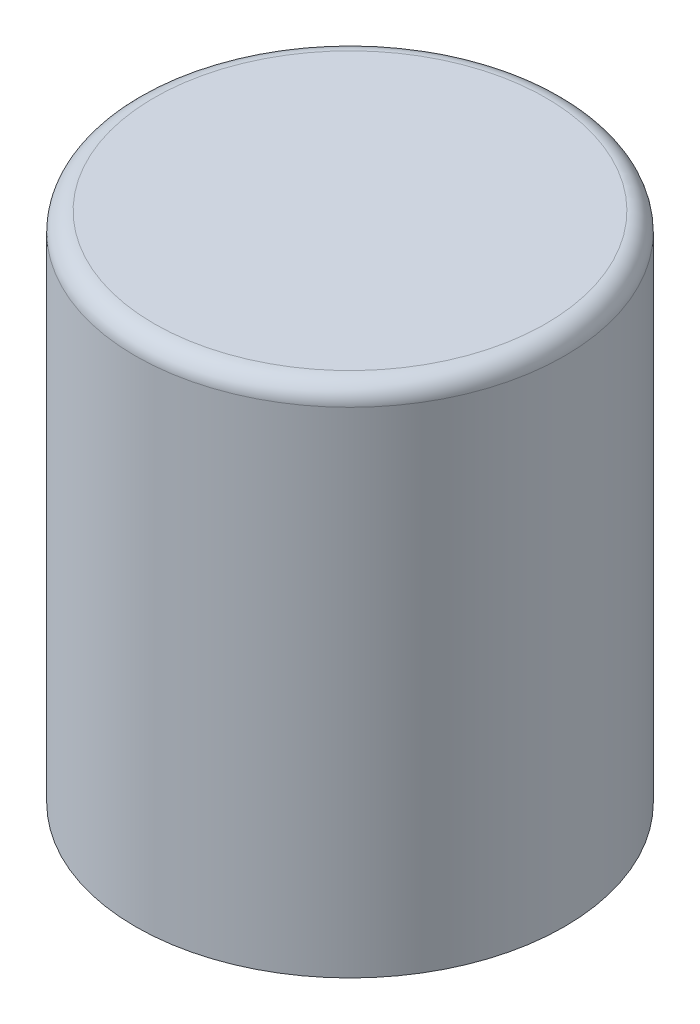
ISO-10303-21;
HEADER;
FILE_DESCRIPTION(('STEP AP214'),'2;1');
FILE_NAME('part.step','',(''),(''),'','','');
FILE_SCHEMA(('AUTOMOTIVE_DESIGN { 1 0 10303 214 1 1 1 1 }'));
ENDSEC;
DATA;
#1=APPLICATION_CONTEXT('core data for automotive mechanical design processes');
#2=APPLICATION_PROTOCOL_DEFINITION('international standard','automotive_design',2000,#1);
#3=PRODUCT_CONTEXT('',#1,'mechanical');
#4=PRODUCT('Part','Part','',(#3));
#5=PRODUCT_RELATED_PRODUCT_CATEGORY('part','',(#4));
#6=PRODUCT_DEFINITION_FORMATION('','',#4);
#7=PRODUCT_DEFINITION_CONTEXT('part definition',#1,'design');
#8=PRODUCT_DEFINITION('design','',#6,#7);
#9=PRODUCT_DEFINITION_SHAPE('','',#8);
#10=(LENGTH_UNIT() NAMED_UNIT(*) SI_UNIT(.MILLI.,.METRE.));
#11=(NAMED_UNIT(*) PLANE_ANGLE_UNIT() SI_UNIT($,.RADIAN.));
#12=(NAMED_UNIT(*) SI_UNIT($,.STERADIAN.) SOLID_ANGLE_UNIT());
#13=UNCERTAINTY_MEASURE_WITH_UNIT(LENGTH_MEASURE(1.E-05),#10,'distance_accuracy_value','');
#14=(GEOMETRIC_REPRESENTATION_CONTEXT(3) GLOBAL_UNCERTAINTY_ASSIGNED_CONTEXT((#13)) GLOBAL_UNIT_ASSIGNED_CONTEXT((#10,
#11,#12)) REPRESENTATION_CONTEXT('',''));
#15=CARTESIAN_POINT('',(0.,0.,0.));
#16=DIRECTION('',(0.,0.,1.));
#17=DIRECTION('',(1.,0.,0.));
#18=AXIS2_PLACEMENT_3D('',#15,#16,#17);
#19=CARTESIAN_POINT('',(0.,5.5,0.));
#20=DIRECTION('',(0.,-1.,0.));
#21=DIRECTION('',(0.,0.,-1.));
#22=AXIS2_PLACEMENT_3D('',#19,#20,#21);
#23=CYLINDRICAL_SURFACE('',#22,2.3);
#24=CARTESIAN_POINT('',(0.,5.3,0.));
#25=DIRECTION('',(0.,1.,0.));
#26=DIRECTION('',(0.,0.,1.));
#27=AXIS2_PLACEMENT_3D('',#24,#25,#26);
#28=CIRCLE('',#27,2.3);
#29=CARTESIAN_POINT('',(0.,5.3,2.3));
#30=VERTEX_POINT('',#29);
#31=EDGE_CURVE('E11',#30,#30,#28,.F.);
#32=ORIENTED_EDGE('',*,*,#31,.T.);
#33=EDGE_LOOP('',(#32));
#34=FACE_BOUND('',#33,.T.);
#35=CARTESIAN_POINT('',(0.,0.,0.));
#36=DIRECTION('',(0.,1.,0.));
#37=DIRECTION('',(0.,0.,1.));
#38=AXIS2_PLACEMENT_3D('',#35,#36,#37);
#39=CIRCLE('',#38,2.3);
#40=CARTESIAN_POINT('',(0.,0.,2.3));
#41=VERTEX_POINT('',#40);
#42=EDGE_CURVE('E111',#41,#41,#39,.T.);
#43=ORIENTED_EDGE('',*,*,#42,.T.);
#44=EDGE_LOOP('',(#43));
#45=FACE_BOUND('',#44,.T.);
#46=ADVANCED_FACE('F35',(#34,#45),#23,.T.);
#47=CARTESIAN_POINT('',(0.,5.5,0.));
#48=DIRECTION('',(0.,1.,0.));
#49=DIRECTION('',(0.,0.,1.));
#50=AXIS2_PLACEMENT_3D('',#47,#48,#49);
#51=PLANE('',#50);
#52=CARTESIAN_POINT('',(0.,5.5,0.));
#53=DIRECTION('',(0.,1.,0.));
#54=DIRECTION('',(0.,0.,1.));
#55=AXIS2_PLACEMENT_3D('',#52,#53,#54);
#56=CIRCLE('',#55,2.1);
#57=CARTESIAN_POINT('',(0.,5.5,2.1));
#58=VERTEX_POINT('',#57);
#59=EDGE_CURVE('E43',#58,#58,#56,.T.);
#60=ORIENTED_EDGE('',*,*,#59,.T.);
#61=EDGE_LOOP('',(#60));
#62=FACE_BOUND('',#61,.T.);
#63=ADVANCED_FACE('F118',(#62),#51,.T.);
#64=CARTESIAN_POINT('',(0.,0.,0.));
#65=DIRECTION('',(0.,1.,0.));
#66=DIRECTION('',(0.,0.,1.));
#67=AXIS2_PLACEMENT_3D('',#64,#65,#66);
#68=PLANE('',#67);
#69=DIRECTION('',(1.,0.,0.));
#70=VECTOR('',#69,1.);
#71=CARTESIAN_POINT('',(-1.2,0.,-1.2));
#72=LINE('',#71,#70);
#73=CARTESIAN_POINT('',(-1.2,0.,-1.2));
#74=VERTEX_POINT('',#73);
#75=CARTESIAN_POINT('',(1.2,0.,-1.2));
#76=VERTEX_POINT('',#75);
#77=EDGE_CURVE('E85',#74,#76,#72,.T.);
#78=ORIENTED_EDGE('',*,*,#77,.F.);
#79=DIRECTION('',(0.,0.,-1.));
#80=VECTOR('',#79,1.);
#81=CARTESIAN_POINT('',(-1.2,0.,1.2));
#82=LINE('',#81,#80);
#83=CARTESIAN_POINT('',(-1.2,0.,1.2));
#84=VERTEX_POINT('',#83);
#85=EDGE_CURVE('E50',#84,#74,#82,.T.);
#86=ORIENTED_EDGE('',*,*,#85,.F.);
#87=DIRECTION('',(-1.,0.,0.));
#88=VECTOR('',#87,1.);
#89=CARTESIAN_POINT('',(-1.2,0.,1.2));
#90=LINE('',#89,#88);
#91=CARTESIAN_POINT('',(1.2,0.,1.2));
#92=VERTEX_POINT('',#91);
#93=EDGE_CURVE('E101',#92,#84,#90,.T.);
#94=ORIENTED_EDGE('',*,*,#93,.F.);
#95=DIRECTION('',(0.,0.,1.));
#96=VECTOR('',#95,1.);
#97=CARTESIAN_POINT('',(1.2,0.,1.2));
#98=LINE('',#97,#96);
#99=EDGE_CURVE('E107',#76,#92,#98,.T.);
#100=ORIENTED_EDGE('',*,*,#99,.F.);
#101=EDGE_LOOP('',(#78,#86,#94,#100));
#102=FACE_BOUND('',#101,.T.);
#103=ORIENTED_EDGE('',*,*,#42,.F.);
#104=EDGE_LOOP('',(#103));
#105=FACE_BOUND('',#104,.T.);
#106=ADVANCED_FACE('F122',(#102,#105),#68,.F.);
#107=CARTESIAN_POINT('',(0.,5.3,0.));
#108=DIRECTION('',(0.,1.,0.));
#109=DIRECTION('',(0.,0.,1.));
#110=AXIS2_PLACEMENT_3D('',#107,#108,#109);
#111=TOROIDAL_SURFACE('',#110,2.1,0.2);
#112=ORIENTED_EDGE('',*,*,#31,.F.);
#113=EDGE_LOOP('',(#112));
#114=FACE_BOUND('',#113,.T.);
#115=ORIENTED_EDGE('',*,*,#59,.F.);
#116=EDGE_LOOP('',(#115));
#117=FACE_BOUND('',#116,.T.);
#118=ADVANCED_FACE('F37',(#114,#117),#111,.T.);
#119=CARTESIAN_POINT('',(-1.2,3.1,1.2));
#120=DIRECTION('',(-1.,0.,0.));
#121=DIRECTION('',(0.,0.,1.));
#122=AXIS2_PLACEMENT_3D('',#119,#120,#121);
#123=PLANE('',#122);
#124=ORIENTED_EDGE('',*,*,#85,.T.);
#125=DIRECTION('',(0.,-1.,0.));
#126=VECTOR('',#125,1.);
#127=CARTESIAN_POINT('',(-1.2,3.1,-1.2));
#128=LINE('',#127,#126);
#129=CARTESIAN_POINT('',(-1.2,3.1,-1.2));
#130=VERTEX_POINT('',#129);
#131=EDGE_CURVE('E73',#130,#74,#128,.T.);
#132=ORIENTED_EDGE('',*,*,#131,.F.);
#133=DIRECTION('',(0.,0.,-1.));
#134=VECTOR('',#133,1.);
#135=CARTESIAN_POINT('',(-1.2,3.1,1.2));
#136=LINE('',#135,#134);
#137=CARTESIAN_POINT('',(-1.2,3.1,1.2));
#138=VERTEX_POINT('',#137);
#139=EDGE_CURVE('E99',#138,#130,#136,.T.);
#140=ORIENTED_EDGE('',*,*,#139,.F.);
#141=DIRECTION('',(0.,-1.,0.));
#142=VECTOR('',#141,1.);
#143=CARTESIAN_POINT('',(-1.2,3.1,1.2));
#144=LINE('',#143,#142);
#145=EDGE_CURVE('E58',#138,#84,#144,.T.);
#146=ORIENTED_EDGE('',*,*,#145,.T.);
#147=EDGE_LOOP('',(#124,#132,#140,#146));
#148=FACE_BOUND('',#147,.T.);
#149=ADVANCED_FACE('F121',(#148),#123,.F.);
#150=CARTESIAN_POINT('',(-1.2,3.1,1.2));
#151=DIRECTION('',(0.,0.,1.));
#152=DIRECTION('',(1.,0.,0.));
#153=AXIS2_PLACEMENT_3D('',#150,#151,#152);
#154=PLANE('',#153);
#155=ORIENTED_EDGE('',*,*,#93,.T.);
#156=ORIENTED_EDGE('',*,*,#145,.F.);
#157=DIRECTION('',(-1.,0.,0.));
#158=VECTOR('',#157,1.);
#159=CARTESIAN_POINT('',(-1.2,3.1,1.2));
#160=LINE('',#159,#158);
#161=CARTESIAN_POINT('',(1.2,3.1,1.2));
#162=VERTEX_POINT('',#161);
#163=EDGE_CURVE('E96',#162,#138,#160,.T.);
#164=ORIENTED_EDGE('',*,*,#163,.F.);
#165=DIRECTION('',(0.,-1.,0.));
#166=VECTOR('',#165,1.);
#167=CARTESIAN_POINT('',(1.2,3.1,1.2));
#168=LINE('',#167,#166);
#169=EDGE_CURVE('E89',#162,#92,#168,.T.);
#170=ORIENTED_EDGE('',*,*,#169,.T.);
#171=EDGE_LOOP('',(#155,#156,#164,#170));
#172=FACE_BOUND('',#171,.T.);
#173=ADVANCED_FACE('F128',(#172),#154,.F.);
#174=CARTESIAN_POINT('',(1.2,3.1,1.2));
#175=DIRECTION('',(1.,0.,0.));
#176=DIRECTION('',(0.,0.,-1.));
#177=AXIS2_PLACEMENT_3D('',#174,#175,#176);
#178=PLANE('',#177);
#179=ORIENTED_EDGE('',*,*,#99,.T.);
#180=ORIENTED_EDGE('',*,*,#169,.F.);
#181=DIRECTION('',(0.,0.,1.));
#182=VECTOR('',#181,1.);
#183=CARTESIAN_POINT('',(1.2,3.1,1.2));
#184=LINE('',#183,#182);
#185=CARTESIAN_POINT('',(1.2,3.1,-1.2));
#186=VERTEX_POINT('',#185);
#187=EDGE_CURVE('E92',#186,#162,#184,.T.);
#188=ORIENTED_EDGE('',*,*,#187,.F.);
#189=DIRECTION('',(0.,-1.,0.));
#190=VECTOR('',#189,1.);
#191=CARTESIAN_POINT('',(1.2,3.1,-1.2));
#192=LINE('',#191,#190);
#193=EDGE_CURVE('E78',#186,#76,#192,.T.);
#194=ORIENTED_EDGE('',*,*,#193,.T.);
#195=EDGE_LOOP('',(#179,#180,#188,#194));
#196=FACE_BOUND('',#195,.T.);
#197=ADVANCED_FACE('F93',(#196),#178,.F.);
#198=CARTESIAN_POINT('',(-1.2,3.1,-1.2));
#199=DIRECTION('',(0.,0.,-1.));
#200=DIRECTION('',(-1.,0.,0.));
#201=AXIS2_PLACEMENT_3D('',#198,#199,#200);
#202=PLANE('',#201);
#203=ORIENTED_EDGE('',*,*,#77,.T.);
#204=ORIENTED_EDGE('',*,*,#193,.F.);
#205=DIRECTION('',(1.,0.,0.));
#206=VECTOR('',#205,1.);
#207=CARTESIAN_POINT('',(-1.2,3.1,-1.2));
#208=LINE('',#207,#206);
#209=EDGE_CURVE('E82',#130,#186,#208,.T.);
#210=ORIENTED_EDGE('',*,*,#209,.F.);
#211=ORIENTED_EDGE('',*,*,#131,.T.);
#212=EDGE_LOOP('',(#203,#204,#210,#211));
#213=FACE_BOUND('',#212,.T.);
#214=ADVANCED_FACE('F80',(#213),#202,.F.);
#215=CARTESIAN_POINT('',(0.,3.1,0.));
#216=DIRECTION('',(0.,-1.,0.));
#217=DIRECTION('',(0.,0.,-1.));
#218=AXIS2_PLACEMENT_3D('',#215,#216,#217);
#219=PLANE('',#218);
#220=ORIENTED_EDGE('',*,*,#139,.T.);
#221=ORIENTED_EDGE('',*,*,#209,.T.);
#222=ORIENTED_EDGE('',*,*,#187,.T.);
#223=ORIENTED_EDGE('',*,*,#163,.T.);
#224=EDGE_LOOP('',(#220,#221,#222,#223));
#225=FACE_BOUND('',#224,.T.);
#226=ADVANCED_FACE('F98',(#225),#219,.T.);
#227=CLOSED_SHELL('',(#46,#63,#106,#118,#149,#173,#197,#214,#226));
#228=MANIFOLD_SOLID_BREP('B2',#227);
#229=ADVANCED_BREP_SHAPE_REPRESENTATION('',(#18,#228),#14);
#230=SHAPE_DEFINITION_REPRESENTATION(#9,#229);
ENDSEC;
END-ISO-10303-21;
